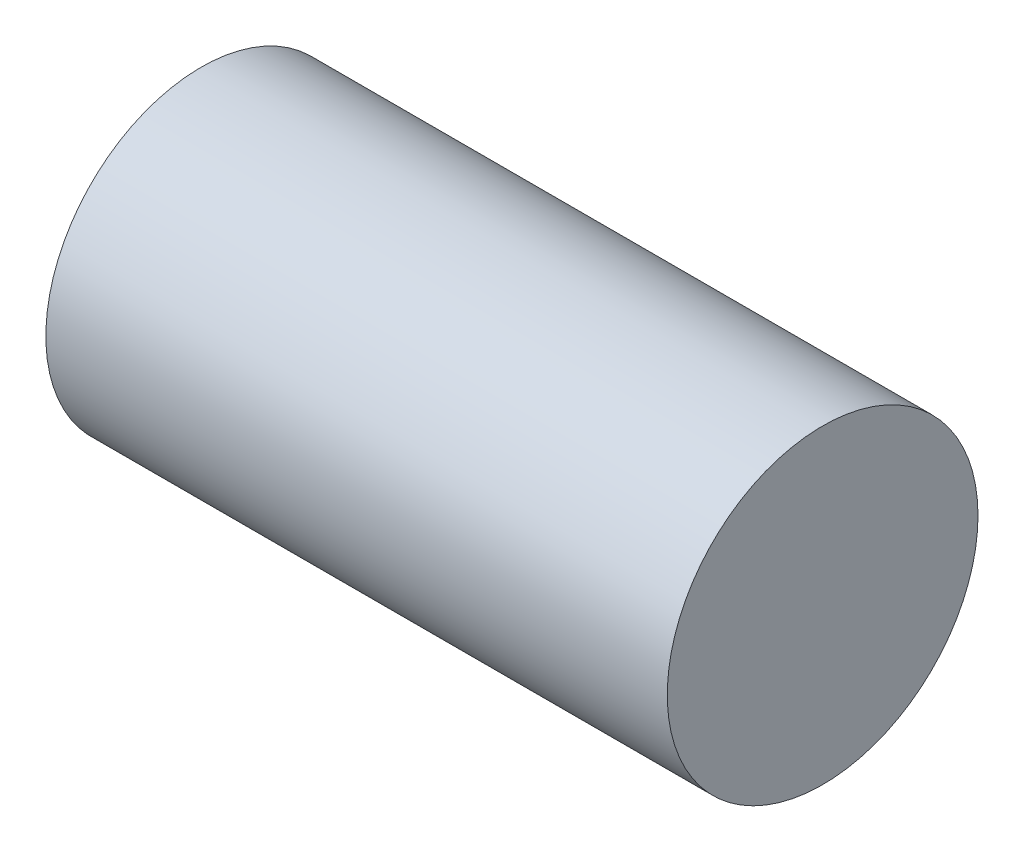
ISO-10303-21;
HEADER;
FILE_DESCRIPTION(('STEP AP214'),'2;1');
FILE_NAME('part.step','',(''),(''),'','','');
FILE_SCHEMA(('AUTOMOTIVE_DESIGN { 1 0 10303 214 1 1 1 1 }'));
ENDSEC;
DATA;
#1=APPLICATION_CONTEXT('core data for automotive mechanical design processes');
#2=APPLICATION_PROTOCOL_DEFINITION('international standard','automotive_design',2000,#1);
#3=PRODUCT_CONTEXT('',#1,'mechanical');
#4=PRODUCT('Part','Part','',(#3));
#5=PRODUCT_RELATED_PRODUCT_CATEGORY('part','',(#4));
#6=PRODUCT_DEFINITION_FORMATION('','',#4);
#7=PRODUCT_DEFINITION_CONTEXT('part definition',#1,'design');
#8=PRODUCT_DEFINITION('design','',#6,#7);
#9=PRODUCT_DEFINITION_SHAPE('','',#8);
#10=(LENGTH_UNIT() NAMED_UNIT(*) SI_UNIT(.MILLI.,.METRE.));
#11=(NAMED_UNIT(*) PLANE_ANGLE_UNIT() SI_UNIT($,.RADIAN.));
#12=(NAMED_UNIT(*) SI_UNIT($,.STERADIAN.) SOLID_ANGLE_UNIT());
#13=UNCERTAINTY_MEASURE_WITH_UNIT(LENGTH_MEASURE(1.E-05),#10,'distance_accuracy_value','');
#14=(GEOMETRIC_REPRESENTATION_CONTEXT(3) GLOBAL_UNCERTAINTY_ASSIGNED_CONTEXT((#13)) GLOBAL_UNIT_ASSIGNED_CONTEXT((#10,
#11,#12)) REPRESENTATION_CONTEXT('',''));
#15=CARTESIAN_POINT('',(0.,0.,0.));
#16=DIRECTION('',(0.,0.,1.));
#17=DIRECTION('',(1.,0.,0.));
#18=AXIS2_PLACEMENT_3D('',#15,#16,#17);
#19=CARTESIAN_POINT('',(30.,0.,0.));
#20=DIRECTION('',(-1.,0.,0.));
#21=DIRECTION('',(0.,0.,1.));
#22=AXIS2_PLACEMENT_3D('',#19,#20,#21);
#23=CYLINDRICAL_SURFACE('',#22,7.5);
#24=CARTESIAN_POINT('',(30.,0.,0.));
#25=DIRECTION('',(1.,0.,0.));
#26=DIRECTION('',(0.,0.,-1.));
#27=AXIS2_PLACEMENT_3D('',#24,#25,#26);
#28=CIRCLE('',#27,7.5);
#29=CARTESIAN_POINT('',(30.,0.,-7.5));
#30=VERTEX_POINT('',#29);
#31=EDGE_CURVE('E10',#30,#30,#28,.T.);
#32=ORIENTED_EDGE('',*,*,#31,.F.);
#33=EDGE_LOOP('',(#32));
#34=FACE_BOUND('',#33,.T.);
#35=CARTESIAN_POINT('',(0.,0.,0.));
#36=DIRECTION('',(1.,0.,0.));
#37=DIRECTION('',(0.,0.,-1.));
#38=AXIS2_PLACEMENT_3D('',#35,#36,#37);
#39=CIRCLE('',#38,7.5);
#40=CARTESIAN_POINT('',(0.,0.,-7.5));
#41=VERTEX_POINT('',#40);
#42=EDGE_CURVE('E33',#41,#41,#39,.T.);
#43=ORIENTED_EDGE('',*,*,#42,.T.);
#44=EDGE_LOOP('',(#43));
#45=FACE_BOUND('',#44,.T.);
#46=ADVANCED_FACE('F30',(#34,#45),#23,.T.);
#47=CARTESIAN_POINT('',(30.,0.,0.));
#48=DIRECTION('',(1.,0.,0.));
#49=DIRECTION('',(0.,0.,-1.));
#50=AXIS2_PLACEMENT_3D('',#47,#48,#49);
#51=PLANE('',#50);
#52=ORIENTED_EDGE('',*,*,#31,.T.);
#53=EDGE_LOOP('',(#52));
#54=FACE_BOUND('',#53,.T.);
#55=ADVANCED_FACE('F45',(#54),#51,.T.);
#56=CARTESIAN_POINT('',(0.,0.,0.));
#57=DIRECTION('',(1.,0.,0.));
#58=DIRECTION('',(0.,0.,-1.));
#59=AXIS2_PLACEMENT_3D('',#56,#57,#58);
#60=PLANE('',#59);
#61=ORIENTED_EDGE('',*,*,#42,.F.);
#62=EDGE_LOOP('',(#61));
#63=FACE_BOUND('',#62,.T.);
#64=ADVANCED_FACE('F43',(#63),#60,.F.);
#65=CLOSED_SHELL('',(#46,#55,#64));
#66=MANIFOLD_SOLID_BREP('B2',#65);
#67=ADVANCED_BREP_SHAPE_REPRESENTATION('',(#18,#66),#14);
#68=SHAPE_DEFINITION_REPRESENTATION(#9,#67);
ENDSEC;
END-ISO-10303-21;
